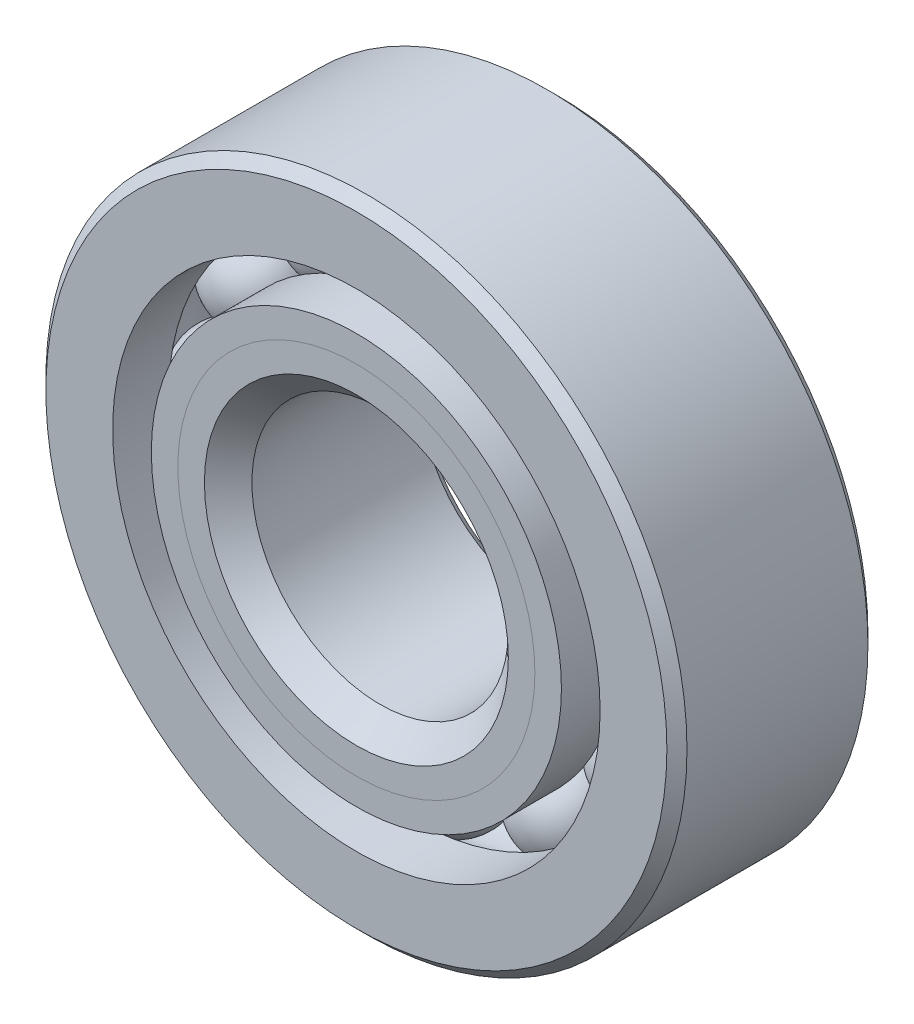
ISO-10303-21;
HEADER;
FILE_DESCRIPTION(('STEP AP214'),'2;1');
FILE_NAME('part.step','',(''),(''),'','','');
FILE_SCHEMA(('AUTOMOTIVE_DESIGN { 1 0 10303 214 1 1 1 1 }'));
ENDSEC;
DATA;
#1=APPLICATION_CONTEXT('core data for automotive mechanical design processes');
#2=APPLICATION_PROTOCOL_DEFINITION('international standard','automotive_design',2000,#1);
#3=PRODUCT_CONTEXT('',#1,'mechanical');
#4=PRODUCT('Part','Part','',(#3));
#5=PRODUCT_RELATED_PRODUCT_CATEGORY('part','',(#4));
#6=PRODUCT_DEFINITION_FORMATION('','',#4);
#7=PRODUCT_DEFINITION_CONTEXT('part definition',#1,'design');
#8=PRODUCT_DEFINITION('design','',#6,#7);
#9=PRODUCT_DEFINITION_SHAPE('','',#8);
#10=(LENGTH_UNIT() NAMED_UNIT(*) SI_UNIT(.MILLI.,.METRE.));
#11=(NAMED_UNIT(*) PLANE_ANGLE_UNIT() SI_UNIT($,.RADIAN.));
#12=(NAMED_UNIT(*) SI_UNIT($,.STERADIAN.) SOLID_ANGLE_UNIT());
#13=UNCERTAINTY_MEASURE_WITH_UNIT(LENGTH_MEASURE(1.E-05),#10,'distance_accuracy_value','');
#14=(GEOMETRIC_REPRESENTATION_CONTEXT(3) GLOBAL_UNCERTAINTY_ASSIGNED_CONTEXT((#13)) GLOBAL_UNIT_ASSIGNED_CONTEXT((#10,
#11,#12)) REPRESENTATION_CONTEXT('',''));
#15=CARTESIAN_POINT('',(0.,0.,0.));
#16=DIRECTION('',(0.,0.,1.));
#17=DIRECTION('',(1.,0.,0.));
#18=AXIS2_PLACEMENT_3D('',#15,#16,#17);
#19=CARTESIAN_POINT('',(-2.77812499999994,4.81185364977732,0.));
#20=DIRECTION('',(0.,0.,1.));
#21=DIRECTION('',(-0.499999999999989,0.866025403784445,0.));
#22=AXIS2_PLACEMENT_3D('',#19,#20,#21);
#23=SPHERICAL_SURFACE('',#22,1.20554465033679);
#24=CARTESIAN_POINT('',(-2.77812499999994,4.81185364977732,1.20554465033679));
#25=VERTEX_POINT('',#24);
#26=VERTEX_LOOP('',#25);
#27=FACE_BOUND('',#26,.T.);
#28=ADVANCED_FACE('F48',(#27),#23,.T.);
#29=CLOSED_SHELL('',(#28));
#30=MANIFOLD_SOLID_BREP('B2',#29);
#31=CARTESIAN_POINT('',(-4.81185364977726,2.77812500000006,0.));
#32=DIRECTION('',(0.,0.,1.));
#33=DIRECTION('',(-0.866025403784433,0.50000000000001,0.));
#34=AXIS2_PLACEMENT_3D('',#31,#32,#33);
#35=SPHERICAL_SURFACE('',#34,1.20554465033679);
#36=CARTESIAN_POINT('',(-4.81185364977726,2.77812500000006,1.20554465033679));
#37=VERTEX_POINT('',#36);
#38=VERTEX_LOOP('',#37);
#39=FACE_BOUND('',#38,.T.);
#40=ADVANCED_FACE('F89',(#39),#35,.T.);
#41=CLOSED_SHELL('',(#40));
#42=MANIFOLD_SOLID_BREP('B6',#41);
#43=CARTESIAN_POINT('',(-5.55625,0.,0.));
#44=DIRECTION('',(0.,0.,1.));
#45=DIRECTION('',(-1.,0.,0.));
#46=AXIS2_PLACEMENT_3D('',#43,#44,#45);
#47=SPHERICAL_SURFACE('',#46,1.20554465033679);
#48=CARTESIAN_POINT('',(-5.55625,0.,1.20554465033679));
#49=VERTEX_POINT('',#48);
#50=VERTEX_LOOP('',#49);
#51=FACE_BOUND('',#50,.T.);
#52=ADVANCED_FACE('F130',(#51),#47,.T.);
#53=CLOSED_SHELL('',(#52));
#54=MANIFOLD_SOLID_BREP('B44',#53);
#55=CARTESIAN_POINT('',(-4.81185364977731,-2.77812499999996,0.));
#56=DIRECTION('',(0.,0.,1.));
#57=DIRECTION('',(-0.866025403784443,-0.499999999999992,0.));
#58=AXIS2_PLACEMENT_3D('',#55,#56,#57);
#59=SPHERICAL_SURFACE('',#58,1.20554465033679);
#60=CARTESIAN_POINT('',(-4.81185364977731,-2.77812499999996,1.20554465033679));
#61=VERTEX_POINT('',#60);
#62=VERTEX_LOOP('',#61);
#63=FACE_BOUND('',#62,.T.);
#64=ADVANCED_FACE('F171',(#63),#59,.T.);
#65=CLOSED_SHELL('',(#64));
#66=MANIFOLD_SOLID_BREP('B85',#65);
#67=CARTESIAN_POINT('',(-2.77812500000004,-4.81185364977727,0.));
#68=DIRECTION('',(0.,0.,1.));
#69=DIRECTION('',(-0.500000000000007,-0.866025403784435,0.));
#70=AXIS2_PLACEMENT_3D('',#67,#68,#69);
#71=SPHERICAL_SURFACE('',#70,1.20554465033679);
#72=CARTESIAN_POINT('',(-2.77812500000004,-4.81185364977727,1.20554465033679));
#73=VERTEX_POINT('',#72);
#74=VERTEX_LOOP('',#73);
#75=FACE_BOUND('',#74,.T.);
#76=ADVANCED_FACE('F212',(#75),#71,.T.);
#77=CLOSED_SHELL('',(#76));
#78=MANIFOLD_SOLID_BREP('B126',#77);
#79=CARTESIAN_POINT('',(0.,-5.55625,0.));
#80=DIRECTION('',(0.,0.,1.));
#81=DIRECTION('',(0.,-1.,0.));
#82=AXIS2_PLACEMENT_3D('',#79,#80,#81);
#83=SPHERICAL_SURFACE('',#82,1.20554465033679);
#84=CARTESIAN_POINT('',(0.,-5.55625,1.20554465033679));
#85=VERTEX_POINT('',#84);
#86=VERTEX_LOOP('',#85);
#87=FACE_BOUND('',#86,.T.);
#88=ADVANCED_FACE('F253',(#87),#83,.T.);
#89=CLOSED_SHELL('',(#88));
#90=MANIFOLD_SOLID_BREP('B167',#89);
#91=CARTESIAN_POINT('',(2.77812499999997,-4.8118536497773,0.));
#92=DIRECTION('',(0.,0.,1.));
#93=DIRECTION('',(0.499999999999995,-0.866025403784442,0.));
#94=AXIS2_PLACEMENT_3D('',#91,#92,#93);
#95=SPHERICAL_SURFACE('',#94,1.20554465033679);
#96=CARTESIAN_POINT('',(2.77812499999997,-4.8118536497773,1.20554465033679));
#97=VERTEX_POINT('',#96);
#98=VERTEX_LOOP('',#97);
#99=FACE_BOUND('',#98,.T.);
#100=ADVANCED_FACE('F294',(#99),#95,.T.);
#101=CLOSED_SHELL('',(#100));
#102=MANIFOLD_SOLID_BREP('B208',#101);
#103=CARTESIAN_POINT('',(4.81185364977728,-2.77812500000002,0.));
#104=DIRECTION('',(0.,0.,1.));
#105=DIRECTION('',(0.866025403784436,-0.500000000000004,0.));
#106=AXIS2_PLACEMENT_3D('',#103,#104,#105);
#107=SPHERICAL_SURFACE('',#106,1.20554465033679);
#108=CARTESIAN_POINT('',(4.81185364977728,-2.77812500000002,1.20554465033679));
#109=VERTEX_POINT('',#108);
#110=VERTEX_LOOP('',#109);
#111=FACE_BOUND('',#110,.T.);
#112=ADVANCED_FACE('F335',(#111),#107,.T.);
#113=CLOSED_SHELL('',(#112));
#114=MANIFOLD_SOLID_BREP('B249',#113);
#115=CARTESIAN_POINT('',(5.55625,0.,0.));
#116=DIRECTION('',(0.,0.,1.));
#117=DIRECTION('',(1.,0.,0.));
#118=AXIS2_PLACEMENT_3D('',#115,#116,#117);
#119=SPHERICAL_SURFACE('',#118,1.20554465033679);
#120=CARTESIAN_POINT('',(5.55625,0.,1.20554465033679));
#121=VERTEX_POINT('',#120);
#122=VERTEX_LOOP('',#121);
#123=FACE_BOUND('',#122,.T.);
#124=ADVANCED_FACE('F376',(#123),#119,.T.);
#125=CLOSED_SHELL('',(#124));
#126=MANIFOLD_SOLID_BREP('B290',#125);
#127=CARTESIAN_POINT('',(4.81185364977729,2.77812499999999,0.));
#128=DIRECTION('',(0.,0.,1.));
#129=DIRECTION('',(0.86602540378444,0.499999999999998,0.));
#130=AXIS2_PLACEMENT_3D('',#127,#128,#129);
#131=SPHERICAL_SURFACE('',#130,1.20554465033679);
#132=CARTESIAN_POINT('',(4.81185364977729,2.77812499999999,1.20554465033679));
#133=VERTEX_POINT('',#132);
#134=VERTEX_LOOP('',#133);
#135=FACE_BOUND('',#134,.T.);
#136=ADVANCED_FACE('F417',(#135),#131,.T.);
#137=CLOSED_SHELL('',(#136));
#138=MANIFOLD_SOLID_BREP('B331',#137);
#139=CARTESIAN_POINT('',(2.77812500000001,4.81185364977728,0.));
#140=DIRECTION('',(0.,0.,1.));
#141=DIRECTION('',(0.500000000000001,0.866025403784438,0.));
#142=AXIS2_PLACEMENT_3D('',#139,#140,#141);
#143=SPHERICAL_SURFACE('',#142,1.20554465033679);
#144=CARTESIAN_POINT('',(2.77812500000001,4.81185364977728,1.20554465033679));
#145=VERTEX_POINT('',#144);
#146=VERTEX_LOOP('',#145);
#147=FACE_BOUND('',#146,.T.);
#148=ADVANCED_FACE('F458',(#147),#143,.T.);
#149=CLOSED_SHELL('',(#148));
#150=MANIFOLD_SOLID_BREP('B372',#149);
#151=CARTESIAN_POINT('',(0.,5.55625,0.));
#152=DIRECTION('',(0.,0.,1.));
#153=DIRECTION('',(0.,1.,0.));
#154=AXIS2_PLACEMENT_3D('',#151,#152,#153);
#155=SPHERICAL_SURFACE('',#154,1.20554465033679);
#156=CARTESIAN_POINT('',(0.,5.55625,1.20554465033679));
#157=VERTEX_POINT('',#156);
#158=VERTEX_LOOP('',#157);
#159=FACE_BOUND('',#158,.T.);
#160=ADVANCED_FACE('F501',(#159),#155,.T.);
#161=CLOSED_SHELL('',(#160));
#162=MANIFOLD_SOLID_BREP('B413',#161);
#163=CARTESIAN_POINT('',(0.,4.42006562313009,2.4892));
#164=DIRECTION('',(0.,0.,-1.));
#165=DIRECTION('',(-1.,0.,0.));
#166=AXIS2_PLACEMENT_3D('',#163,#164,#165);
#167=PLANE('',#166);
#168=CARTESIAN_POINT('',(0.,0.,2.4892));
#169=DIRECTION('',(0.,0.,1.));
#170=DIRECTION('',(1.,0.,0.));
#171=AXIS2_PLACEMENT_3D('',#168,#169,#170);
#172=CIRCLE('',#171,3.7628526748316);
#173=CARTESIAN_POINT('',(3.7628526748316,0.,2.4892));
#174=VERTEX_POINT('',#173);
#175=EDGE_CURVE('E554',#174,#174,#172,.T.);
#176=ORIENTED_EDGE('',*,*,#175,.F.);
#177=EDGE_LOOP('',(#176));
#178=FACE_BOUND('',#177,.T.);
#179=CARTESIAN_POINT('',(0.,0.,2.4892));
#180=DIRECTION('',(0.,0.,1.));
#181=DIRECTION('',(1.,0.,0.));
#182=AXIS2_PLACEMENT_3D('',#179,#180,#181);
#183=CIRCLE('',#182,4.42006562313009);
#184=CARTESIAN_POINT('',(4.42006562313009,0.,2.4892));
#185=VERTEX_POINT('',#184);
#186=EDGE_CURVE('E500',#185,#185,#183,.T.);
#187=ORIENTED_EDGE('',*,*,#186,.T.);
#188=EDGE_LOOP('',(#187));
#189=FACE_BOUND('',#188,.T.);
#190=ADVANCED_FACE('F520',(#178,#189),#167,.F.);
#191=CARTESIAN_POINT('',(0.,0.,1.83198705170152));
#192=DIRECTION('',(0.,0.,1.));
#193=DIRECTION('',(1.,0.,0.));
#194=AXIS2_PLACEMENT_3D('',#191,#192,#193);
#195=CONICAL_SURFACE('',#194,3.7628526748316,0.78539816339745);
#196=ORIENTED_EDGE('',*,*,#186,.F.);
#197=EDGE_LOOP('',(#196));
#198=FACE_BOUND('',#197,.T.);
#199=CARTESIAN_POINT('',(0.,0.,1.83198705170152));
#200=DIRECTION('',(0.,0.,1.));
#201=DIRECTION('',(1.,0.,0.));
#202=AXIS2_PLACEMENT_3D('',#199,#200,#201);
#203=CIRCLE('',#202,3.7628526748316);
#204=CARTESIAN_POINT('',(3.7628526748316,0.,1.83198705170152));
#205=VERTEX_POINT('',#204);
#206=EDGE_CURVE('E526',#205,#205,#203,.T.);
#207=ORIENTED_EDGE('',*,*,#206,.T.);
#208=EDGE_LOOP('',(#207));
#209=FACE_BOUND('',#208,.T.);
#210=ADVANCED_FACE('F561',(#198,#209),#195,.T.);
#211=CARTESIAN_POINT('',(0.,0.,2.4892));
#212=DIRECTION('',(0.,0.,1.));
#213=DIRECTION('',(1.,0.,0.));
#214=AXIS2_PLACEMENT_3D('',#211,#212,#213);
#215=CYLINDRICAL_SURFACE('',#214,3.7628526748316);
#216=ORIENTED_EDGE('',*,*,#206,.F.);
#217=EDGE_LOOP('',(#216));
#218=FACE_BOUND('',#217,.T.);
#219=CARTESIAN_POINT('',(0.,0.,0.));
#220=DIRECTION('',(0.,0.,1.));
#221=DIRECTION('',(1.,0.,0.));
#222=AXIS2_PLACEMENT_3D('',#219,#220,#221);
#223=CIRCLE('',#222,3.7628526748316);
#224=CARTESIAN_POINT('',(3.7628526748316,0.,0.));
#225=VERTEX_POINT('',#224);
#226=EDGE_CURVE('E530',#225,#225,#223,.T.);
#227=ORIENTED_EDGE('',*,*,#226,.T.);
#228=EDGE_LOOP('',(#227));
#229=FACE_BOUND('',#228,.T.);
#230=ADVANCED_FACE('F565',(#218,#229),#215,.T.);
#231=CARTESIAN_POINT('',(0.,3.7628526748316,0.));
#232=DIRECTION('',(0.,0.,-1.));
#233=DIRECTION('',(-1.,0.,0.));
#234=AXIS2_PLACEMENT_3D('',#231,#232,#233);
#235=PLANE('',#234);
#236=ORIENTED_EDGE('',*,*,#226,.F.);
#237=EDGE_LOOP('',(#236));
#238=FACE_BOUND('',#237,.T.);
#239=CARTESIAN_POINT('',(0.,0.,0.));
#240=DIRECTION('',(0.,0.,1.));
#241=DIRECTION('',(1.,0.,0.));
#242=AXIS2_PLACEMENT_3D('',#239,#240,#241);
#243=CIRCLE('',#242,4.35070534966321);
#244=CARTESIAN_POINT('',(4.35070534966321,0.,0.));
#245=VERTEX_POINT('',#244);
#246=EDGE_CURVE('E534',#245,#245,#243,.T.);
#247=ORIENTED_EDGE('',*,*,#246,.T.);
#248=EDGE_LOOP('',(#247));
#249=FACE_BOUND('',#248,.T.);
#250=ADVANCED_FACE('F570',(#238,#249),#235,.F.);
#251=CARTESIAN_POINT('',(0.,0.,0.));
#252=DIRECTION('',(0.,0.,1.));
#253=DIRECTION('',(1.,0.,0.));
#254=AXIS2_PLACEMENT_3D('',#251,#252,#253);
#255=TOROIDAL_SURFACE('',#254,5.55625,1.20554465033679);
#256=ORIENTED_EDGE('',*,*,#246,.F.);
#257=EDGE_LOOP('',(#256));
#258=FACE_BOUND('',#257,.T.);
#259=CARTESIAN_POINT('',(0.,0.,-1.10631111111111));
#260=DIRECTION('',(0.,0.,1.));
#261=DIRECTION('',(1.,0.,0.));
#262=AXIS2_PLACEMENT_3D('',#259,#260,#261);
#263=CIRCLE('',#262,5.07727857142857);
#264=CARTESIAN_POINT('',(5.07727857142857,0.,-1.10631111111111));
#265=VERTEX_POINT('',#264);
#266=EDGE_CURVE('E539',#265,#265,#263,.T.);
#267=ORIENTED_EDGE('',*,*,#266,.T.);
#268=EDGE_LOOP('',(#267));
#269=FACE_BOUND('',#268,.T.);
#270=ADVANCED_FACE('F576',(#258,#269),#255,.F.);
#271=CARTESIAN_POINT('',(0.,0.,2.4892));
#272=DIRECTION('',(0.,0.,1.));
#273=DIRECTION('',(1.,0.,0.));
#274=AXIS2_PLACEMENT_3D('',#271,#272,#273);
#275=CYLINDRICAL_SURFACE('',#274,5.07727857142857);
#276=ORIENTED_EDGE('',*,*,#266,.F.);
#277=EDGE_LOOP('',(#276));
#278=FACE_BOUND('',#277,.T.);
#279=CARTESIAN_POINT('',(0.,0.,-2.4892));
#280=DIRECTION('',(0.,0.,1.));
#281=DIRECTION('',(1.,0.,0.));
#282=AXIS2_PLACEMENT_3D('',#279,#280,#281);
#283=CIRCLE('',#282,5.07727857142857);
#284=CARTESIAN_POINT('',(5.07727857142857,0.,-2.4892));
#285=VERTEX_POINT('',#284);
#286=EDGE_CURVE('E542',#285,#285,#283,.T.);
#287=ORIENTED_EDGE('',*,*,#286,.T.);
#288=EDGE_LOOP('',(#287));
#289=FACE_BOUND('',#288,.T.);
#290=ADVANCED_FACE('F580',(#278,#289),#275,.T.);
#291=CARTESIAN_POINT('',(0.,3.42392,-2.4892));
#292=DIRECTION('',(0.,0.,1.));
#293=DIRECTION('',(1.,0.,0.));
#294=AXIS2_PLACEMENT_3D('',#291,#292,#293);
#295=PLANE('',#294);
#296=ORIENTED_EDGE('',*,*,#286,.F.);
#297=EDGE_LOOP('',(#296));
#298=FACE_BOUND('',#297,.T.);
#299=CARTESIAN_POINT('',(0.,0.,-2.4892));
#300=DIRECTION('',(0.,0.,1.));
#301=DIRECTION('',(1.,0.,0.));
#302=AXIS2_PLACEMENT_3D('',#299,#300,#301);
#303=CIRCLE('',#302,3.42392);
#304=CARTESIAN_POINT('',(3.42392,0.,-2.4892));
#305=VERTEX_POINT('',#304);
#306=EDGE_CURVE('E545',#305,#305,#303,.T.);
#307=ORIENTED_EDGE('',*,*,#306,.T.);
#308=EDGE_LOOP('',(#307));
#309=FACE_BOUND('',#308,.T.);
#310=ADVANCED_FACE('F584',(#298,#309),#295,.F.);
#311=CARTESIAN_POINT('',(0.,0.,-2.24028));
#312=DIRECTION('',(0.,0.,-1.));
#313=DIRECTION('',(-1.,0.,0.));
#314=AXIS2_PLACEMENT_3D('',#311,#312,#313);
#315=CONICAL_SURFACE('',#314,3.175,0.785398163397447);
#316=ORIENTED_EDGE('',*,*,#306,.F.);
#317=EDGE_LOOP('',(#316));
#318=FACE_BOUND('',#317,.T.);
#319=CARTESIAN_POINT('',(0.,0.,-2.24028));
#320=DIRECTION('',(0.,0.,1.));
#321=DIRECTION('',(1.,0.,0.));
#322=AXIS2_PLACEMENT_3D('',#319,#320,#321);
#323=CIRCLE('',#322,3.175);
#324=CARTESIAN_POINT('',(3.175,0.,-2.24028));
#325=VERTEX_POINT('',#324);
#326=EDGE_CURVE('E548',#325,#325,#323,.T.);
#327=ORIENTED_EDGE('',*,*,#326,.T.);
#328=EDGE_LOOP('',(#327));
#329=FACE_BOUND('',#328,.T.);
#330=ADVANCED_FACE('F588',(#318,#329),#315,.F.);
#331=CARTESIAN_POINT('',(0.,0.,2.4892));
#332=DIRECTION('',(0.,0.,1.));
#333=DIRECTION('',(1.,0.,0.));
#334=AXIS2_PLACEMENT_3D('',#331,#332,#333);
#335=CYLINDRICAL_SURFACE('',#334,3.175);
#336=ORIENTED_EDGE('',*,*,#326,.F.);
#337=EDGE_LOOP('',(#336));
#338=FACE_BOUND('',#337,.T.);
#339=CARTESIAN_POINT('',(0.,0.,1.9013473251684));
#340=DIRECTION('',(0.,0.,1.));
#341=DIRECTION('',(1.,0.,0.));
#342=AXIS2_PLACEMENT_3D('',#339,#340,#341);
#343=CIRCLE('',#342,3.175);
#344=CARTESIAN_POINT('',(3.175,0.,1.9013473251684));
#345=VERTEX_POINT('',#344);
#346=EDGE_CURVE('E551',#345,#345,#343,.T.);
#347=ORIENTED_EDGE('',*,*,#346,.T.);
#348=EDGE_LOOP('',(#347));
#349=FACE_BOUND('',#348,.T.);
#350=ADVANCED_FACE('F592',(#338,#349),#335,.F.);
#351=CARTESIAN_POINT('',(0.,0.,2.4892));
#352=DIRECTION('',(0.,0.,1.));
#353=DIRECTION('',(1.,0.,0.));
#354=AXIS2_PLACEMENT_3D('',#351,#352,#353);
#355=CONICAL_SURFACE('',#354,3.7628526748316,0.785398163397449);
#356=ORIENTED_EDGE('',*,*,#346,.F.);
#357=EDGE_LOOP('',(#356));
#358=FACE_BOUND('',#357,.T.);
#359=ORIENTED_EDGE('',*,*,#175,.T.);
#360=EDGE_LOOP('',(#359));
#361=FACE_BOUND('',#360,.T.);
#362=ADVANCED_FACE('F558',(#358,#361),#355,.F.);
#363=CLOSED_SHELL('',(#190,#210,#230,#250,#270,#290,#310,#330,#350,#362));
#364=MANIFOLD_SOLID_BREP('B454',#363);
#365=CARTESIAN_POINT('',(0.,5.07727857142857,2.4892));
#366=DIRECTION('',(0.,0.,-1.));
#367=DIRECTION('',(-1.,0.,0.));
#368=AXIS2_PLACEMENT_3D('',#365,#366,#367);
#369=PLANE('',#368);
#370=CARTESIAN_POINT('',(0.,0.,2.4892));
#371=DIRECTION('',(0.,0.,1.));
#372=DIRECTION('',(1.,0.,0.));
#373=AXIS2_PLACEMENT_3D('',#370,#371,#372);
#374=CIRCLE('',#373,4.42006562313009);
#375=CARTESIAN_POINT('',(4.42006562313009,0.,2.4892));
#376=VERTEX_POINT('',#375);
#377=EDGE_CURVE('E519',#376,#376,#374,.T.);
#378=ORIENTED_EDGE('',*,*,#377,.F.);
#379=EDGE_LOOP('',(#378));
#380=FACE_BOUND('',#379,.T.);
#381=CARTESIAN_POINT('',(0.,0.,2.4892));
#382=DIRECTION('',(0.,0.,1.));
#383=DIRECTION('',(1.,0.,0.));
#384=AXIS2_PLACEMENT_3D('',#381,#382,#383);
#385=CIRCLE('',#384,5.07727857142857);
#386=CARTESIAN_POINT('',(5.07727857142857,0.,2.4892));
#387=VERTEX_POINT('',#386);
#388=EDGE_CURVE('E681',#387,#387,#385,.T.);
#389=ORIENTED_EDGE('',*,*,#388,.T.);
#390=EDGE_LOOP('',(#389));
#391=FACE_BOUND('',#390,.T.);
#392=ADVANCED_FACE('F659',(#380,#391),#369,.F.);
#393=CARTESIAN_POINT('',(0.,0.,2.4892));
#394=DIRECTION('',(0.,0.,1.));
#395=DIRECTION('',(1.,0.,0.));
#396=AXIS2_PLACEMENT_3D('',#393,#394,#395);
#397=CONICAL_SURFACE('',#396,4.42006562313009,0.78539816339745);
#398=CARTESIAN_POINT('',(0.,0.,1.83198705170152));
#399=DIRECTION('',(0.,0.,1.));
#400=DIRECTION('',(1.,0.,0.));
#401=AXIS2_PLACEMENT_3D('',#398,#399,#400);
#402=CIRCLE('',#401,3.7628526748316);
#403=CARTESIAN_POINT('',(3.7628526748316,0.,1.83198705170152));
#404=VERTEX_POINT('',#403);
#405=EDGE_CURVE('E665',#404,#404,#402,.T.);
#406=ORIENTED_EDGE('',*,*,#405,.F.);
#407=EDGE_LOOP('',(#406));
#408=FACE_BOUND('',#407,.T.);
#409=ORIENTED_EDGE('',*,*,#377,.T.);
#410=EDGE_LOOP('',(#409));
#411=FACE_BOUND('',#410,.T.);
#412=ADVANCED_FACE('F706',(#408,#411),#397,.F.);
#413=CARTESIAN_POINT('',(0.,0.,2.4892));
#414=DIRECTION('',(0.,0.,1.));
#415=DIRECTION('',(1.,0.,0.));
#416=AXIS2_PLACEMENT_3D('',#413,#414,#415);
#417=CYLINDRICAL_SURFACE('',#416,3.7628526748316);
#418=CARTESIAN_POINT('',(0.,0.,0.));
#419=DIRECTION('',(0.,0.,1.));
#420=DIRECTION('',(1.,0.,0.));
#421=AXIS2_PLACEMENT_3D('',#418,#419,#420);
#422=CIRCLE('',#421,3.7628526748316);
#423=CARTESIAN_POINT('',(3.7628526748316,0.,0.));
#424=VERTEX_POINT('',#423);
#425=EDGE_CURVE('E669',#424,#424,#422,.T.);
#426=ORIENTED_EDGE('',*,*,#425,.F.);
#427=EDGE_LOOP('',(#426));
#428=FACE_BOUND('',#427,.T.);
#429=ORIENTED_EDGE('',*,*,#405,.T.);
#430=EDGE_LOOP('',(#429));
#431=FACE_BOUND('',#430,.T.);
#432=ADVANCED_FACE('F701',(#428,#431),#417,.F.);
#433=CARTESIAN_POINT('',(0.,3.7628526748316,0.));
#434=DIRECTION('',(0.,0.,1.));
#435=DIRECTION('',(1.,0.,0.));
#436=AXIS2_PLACEMENT_3D('',#433,#434,#435);
#437=PLANE('',#436);
#438=CARTESIAN_POINT('',(0.,0.,0.));
#439=DIRECTION('',(0.,0.,1.));
#440=DIRECTION('',(1.,0.,0.));
#441=AXIS2_PLACEMENT_3D('',#438,#439,#440);
#442=CIRCLE('',#441,4.35070534966321);
#443=CARTESIAN_POINT('',(4.35070534966321,0.,0.));
#444=VERTEX_POINT('',#443);
#445=EDGE_CURVE('E673',#444,#444,#442,.T.);
#446=ORIENTED_EDGE('',*,*,#445,.F.);
#447=EDGE_LOOP('',(#446));
#448=FACE_BOUND('',#447,.T.);
#449=ORIENTED_EDGE('',*,*,#425,.T.);
#450=EDGE_LOOP('',(#449));
#451=FACE_BOUND('',#450,.T.);
#452=ADVANCED_FACE('F695',(#448,#451),#437,.F.);
#453=CARTESIAN_POINT('',(0.,0.,0.));
#454=DIRECTION('',(0.,0.,1.));
#455=DIRECTION('',(1.,0.,0.));
#456=AXIS2_PLACEMENT_3D('',#453,#454,#455);
#457=TOROIDAL_SURFACE('',#456,5.55625,1.20554465033679);
#458=CARTESIAN_POINT('',(0.,0.,1.10631111111111));
#459=DIRECTION('',(0.,0.,1.));
#460=DIRECTION('',(1.,0.,0.));
#461=AXIS2_PLACEMENT_3D('',#458,#459,#460);
#462=CIRCLE('',#461,5.07727857142857);
#463=CARTESIAN_POINT('',(5.07727857142857,0.,1.10631111111111));
#464=VERTEX_POINT('',#463);
#465=EDGE_CURVE('E678',#464,#464,#462,.T.);
#466=ORIENTED_EDGE('',*,*,#465,.F.);
#467=EDGE_LOOP('',(#466));
#468=FACE_BOUND('',#467,.T.);
#469=ORIENTED_EDGE('',*,*,#445,.T.);
#470=EDGE_LOOP('',(#469));
#471=FACE_BOUND('',#470,.T.);
#472=ADVANCED_FACE('F689',(#468,#471),#457,.F.);
#473=CARTESIAN_POINT('',(0.,0.,2.4892));
#474=DIRECTION('',(0.,0.,1.));
#475=DIRECTION('',(1.,0.,0.));
#476=AXIS2_PLACEMENT_3D('',#473,#474,#475);
#477=CYLINDRICAL_SURFACE('',#476,5.07727857142857);
#478=ORIENTED_EDGE('',*,*,#388,.F.);
#479=EDGE_LOOP('',(#478));
#480=FACE_BOUND('',#479,.T.);
#481=ORIENTED_EDGE('',*,*,#465,.T.);
#482=EDGE_LOOP('',(#481));
#483=FACE_BOUND('',#482,.T.);
#484=ADVANCED_FACE('F686',(#480,#483),#477,.T.);
#485=CLOSED_SHELL('',(#392,#412,#432,#452,#472,#484));
#486=MANIFOLD_SOLID_BREP('B495',#485);
#487=CARTESIAN_POINT('',(0.,0.,2.24028));
#488=DIRECTION('',(0.,0.,-1.));
#489=DIRECTION('',(-1.,0.,0.));
#490=AXIS2_PLACEMENT_3D('',#487,#488,#489);
#491=CONICAL_SURFACE('',#490,7.9375,0.785398163397447);
#492=CARTESIAN_POINT('',(0.,0.,2.4892));
#493=DIRECTION('',(0.,0.,1.));
#494=DIRECTION('',(1.,0.,0.));
#495=AXIS2_PLACEMENT_3D('',#492,#493,#494);
#496=CIRCLE('',#495,7.68858);
#497=CARTESIAN_POINT('',(7.68858,0.,2.4892));
#498=VERTEX_POINT('',#497);
#499=EDGE_CURVE('E767',#498,#498,#496,.T.);
#500=ORIENTED_EDGE('',*,*,#499,.F.);
#501=EDGE_LOOP('',(#500));
#502=FACE_BOUND('',#501,.T.);
#503=CARTESIAN_POINT('',(0.,0.,2.24028));
#504=DIRECTION('',(0.,0.,1.));
#505=DIRECTION('',(1.,0.,0.));
#506=AXIS2_PLACEMENT_3D('',#503,#504,#505);
#507=CIRCLE('',#506,7.9375);
#508=CARTESIAN_POINT('',(7.9375,0.,2.24028));
#509=VERTEX_POINT('',#508);
#510=EDGE_CURVE('E658',#509,#509,#507,.T.);
#511=ORIENTED_EDGE('',*,*,#510,.T.);
#512=EDGE_LOOP('',(#511));
#513=FACE_BOUND('',#512,.T.);
#514=ADVANCED_FACE('F739',(#502,#513),#491,.T.);
#515=CARTESIAN_POINT('',(0.,0.,2.4892));
#516=DIRECTION('',(0.,0.,1.));
#517=DIRECTION('',(1.,0.,0.));
#518=AXIS2_PLACEMENT_3D('',#515,#516,#517);
#519=CYLINDRICAL_SURFACE('',#518,7.9375);
#520=ORIENTED_EDGE('',*,*,#510,.F.);
#521=EDGE_LOOP('',(#520));
#522=FACE_BOUND('',#521,.T.);
#523=CARTESIAN_POINT('',(0.,0.,-2.24028));
#524=DIRECTION('',(0.,0.,1.));
#525=DIRECTION('',(1.,0.,0.));
#526=AXIS2_PLACEMENT_3D('',#523,#524,#525);
#527=CIRCLE('',#526,7.9375);
#528=CARTESIAN_POINT('',(7.9375,0.,-2.24028));
#529=VERTEX_POINT('',#528);
#530=EDGE_CURVE('E745',#529,#529,#527,.T.);
#531=ORIENTED_EDGE('',*,*,#530,.T.);
#532=EDGE_LOOP('',(#531));
#533=FACE_BOUND('',#532,.T.);
#534=ADVANCED_FACE('F774',(#522,#533),#519,.T.);
#535=CARTESIAN_POINT('',(0.,0.,-2.4892));
#536=DIRECTION('',(0.,0.,1.));
#537=DIRECTION('',(1.,0.,0.));
#538=AXIS2_PLACEMENT_3D('',#535,#536,#537);
#539=CONICAL_SURFACE('',#538,7.68858,0.785398163397445);
#540=ORIENTED_EDGE('',*,*,#530,.F.);
#541=EDGE_LOOP('',(#540));
#542=FACE_BOUND('',#541,.T.);
#543=CARTESIAN_POINT('',(0.,0.,-2.4892));
#544=DIRECTION('',(0.,0.,1.));
#545=DIRECTION('',(1.,0.,0.));
#546=AXIS2_PLACEMENT_3D('',#543,#544,#545);
#547=CIRCLE('',#546,7.68858);
#548=CARTESIAN_POINT('',(7.68858,0.,-2.4892));
#549=VERTEX_POINT('',#548);
#550=EDGE_CURVE('E749',#549,#549,#547,.T.);
#551=ORIENTED_EDGE('',*,*,#550,.T.);
#552=EDGE_LOOP('',(#551));
#553=FACE_BOUND('',#552,.T.);
#554=ADVANCED_FACE('F778',(#542,#553),#539,.T.);
#555=CARTESIAN_POINT('',(0.,7.68858,-2.4892));
#556=DIRECTION('',(0.,0.,1.));
#557=DIRECTION('',(1.,0.,0.));
#558=AXIS2_PLACEMENT_3D('',#555,#556,#557);
#559=PLANE('',#558);
#560=ORIENTED_EDGE('',*,*,#550,.F.);
#561=EDGE_LOOP('',(#560));
#562=FACE_BOUND('',#561,.T.);
#563=CARTESIAN_POINT('',(0.,0.,-2.4892));
#564=DIRECTION('',(0.,0.,1.));
#565=DIRECTION('',(1.,0.,0.));
#566=AXIS2_PLACEMENT_3D('',#563,#564,#565);
#567=CIRCLE('',#566,6.03522142857143);
#568=CARTESIAN_POINT('',(6.03522142857143,0.,-2.4892));
#569=VERTEX_POINT('',#568);
#570=EDGE_CURVE('E753',#569,#569,#567,.T.);
#571=ORIENTED_EDGE('',*,*,#570,.T.);
#572=EDGE_LOOP('',(#571));
#573=FACE_BOUND('',#572,.T.);
#574=ADVANCED_FACE('F783',(#562,#573),#559,.F.);
#575=CARTESIAN_POINT('',(0.,0.,2.4892));
#576=DIRECTION('',(0.,0.,1.));
#577=DIRECTION('',(1.,0.,0.));
#578=AXIS2_PLACEMENT_3D('',#575,#576,#577);
#579=CYLINDRICAL_SURFACE('',#578,6.03522142857143);
#580=ORIENTED_EDGE('',*,*,#570,.F.);
#581=EDGE_LOOP('',(#580));
#582=FACE_BOUND('',#581,.T.);
#583=CARTESIAN_POINT('',(0.,0.,-1.10631111111111));
#584=DIRECTION('',(0.,0.,1.));
#585=DIRECTION('',(1.,0.,0.));
#586=AXIS2_PLACEMENT_3D('',#583,#584,#585);
#587=CIRCLE('',#586,6.03522142857143);
#588=CARTESIAN_POINT('',(6.03522142857143,0.,-1.10631111111111));
#589=VERTEX_POINT('',#588);
#590=EDGE_CURVE('E758',#589,#589,#587,.T.);
#591=ORIENTED_EDGE('',*,*,#590,.T.);
#592=EDGE_LOOP('',(#591));
#593=FACE_BOUND('',#592,.T.);
#594=ADVANCED_FACE('F789',(#582,#593),#579,.F.);
#595=CARTESIAN_POINT('',(0.,0.,0.));
#596=DIRECTION('',(0.,0.,1.));
#597=DIRECTION('',(1.,0.,0.));
#598=AXIS2_PLACEMENT_3D('',#595,#596,#597);
#599=TOROIDAL_SURFACE('',#598,5.55625,1.20554465033679);
#600=ORIENTED_EDGE('',*,*,#590,.F.);
#601=EDGE_LOOP('',(#600));
#602=FACE_BOUND('',#601,.T.);
#603=CARTESIAN_POINT('',(0.,0.,1.10631111111111));
#604=DIRECTION('',(0.,0.,1.));
#605=DIRECTION('',(1.,0.,0.));
#606=AXIS2_PLACEMENT_3D('',#603,#604,#605);
#607=CIRCLE('',#606,6.03522142857143);
#608=CARTESIAN_POINT('',(6.03522142857143,0.,1.10631111111111));
#609=VERTEX_POINT('',#608);
#610=EDGE_CURVE('E761',#609,#609,#607,.T.);
#611=ORIENTED_EDGE('',*,*,#610,.T.);
#612=EDGE_LOOP('',(#611));
#613=FACE_BOUND('',#612,.T.);
#614=ADVANCED_FACE('F793',(#602,#613),#599,.F.);
#615=CARTESIAN_POINT('',(0.,0.,2.4892));
#616=DIRECTION('',(0.,0.,1.));
#617=DIRECTION('',(1.,0.,0.));
#618=AXIS2_PLACEMENT_3D('',#615,#616,#617);
#619=CYLINDRICAL_SURFACE('',#618,6.03522142857143);
#620=ORIENTED_EDGE('',*,*,#610,.F.);
#621=EDGE_LOOP('',(#620));
#622=FACE_BOUND('',#621,.T.);
#623=CARTESIAN_POINT('',(0.,0.,2.4892));
#624=DIRECTION('',(0.,0.,1.));
#625=DIRECTION('',(1.,0.,0.));
#626=AXIS2_PLACEMENT_3D('',#623,#624,#625);
#627=CIRCLE('',#626,6.03522142857143);
#628=CARTESIAN_POINT('',(6.03522142857143,0.,2.4892));
#629=VERTEX_POINT('',#628);
#630=EDGE_CURVE('E764',#629,#629,#627,.T.);
#631=ORIENTED_EDGE('',*,*,#630,.T.);
#632=EDGE_LOOP('',(#631));
#633=FACE_BOUND('',#632,.T.);
#634=ADVANCED_FACE('F797',(#622,#633),#619,.F.);
#635=CARTESIAN_POINT('',(0.,7.68858,2.4892));
#636=DIRECTION('',(0.,0.,-1.));
#637=DIRECTION('',(-1.,0.,0.));
#638=AXIS2_PLACEMENT_3D('',#635,#636,#637);
#639=PLANE('',#638);
#640=ORIENTED_EDGE('',*,*,#630,.F.);
#641=EDGE_LOOP('',(#640));
#642=FACE_BOUND('',#641,.T.);
#643=ORIENTED_EDGE('',*,*,#499,.T.);
#644=EDGE_LOOP('',(#643));
#645=FACE_BOUND('',#644,.T.);
#646=ADVANCED_FACE('F771',(#642,#645),#639,.F.);
#647=CLOSED_SHELL('',(#514,#534,#554,#574,#594,#614,#634,#646));
#648=MANIFOLD_SOLID_BREP('B514',#647);
#649=ADVANCED_BREP_SHAPE_REPRESENTATION('',(#18,#30,#42,#54,#66,#78,#90,#102,#114,#126,#138,
#150,#162,#364,#486,#648),#14);
#650=SHAPE_DEFINITION_REPRESENTATION(#9,#649);
ENDSEC;
END-ISO-10303-21;
